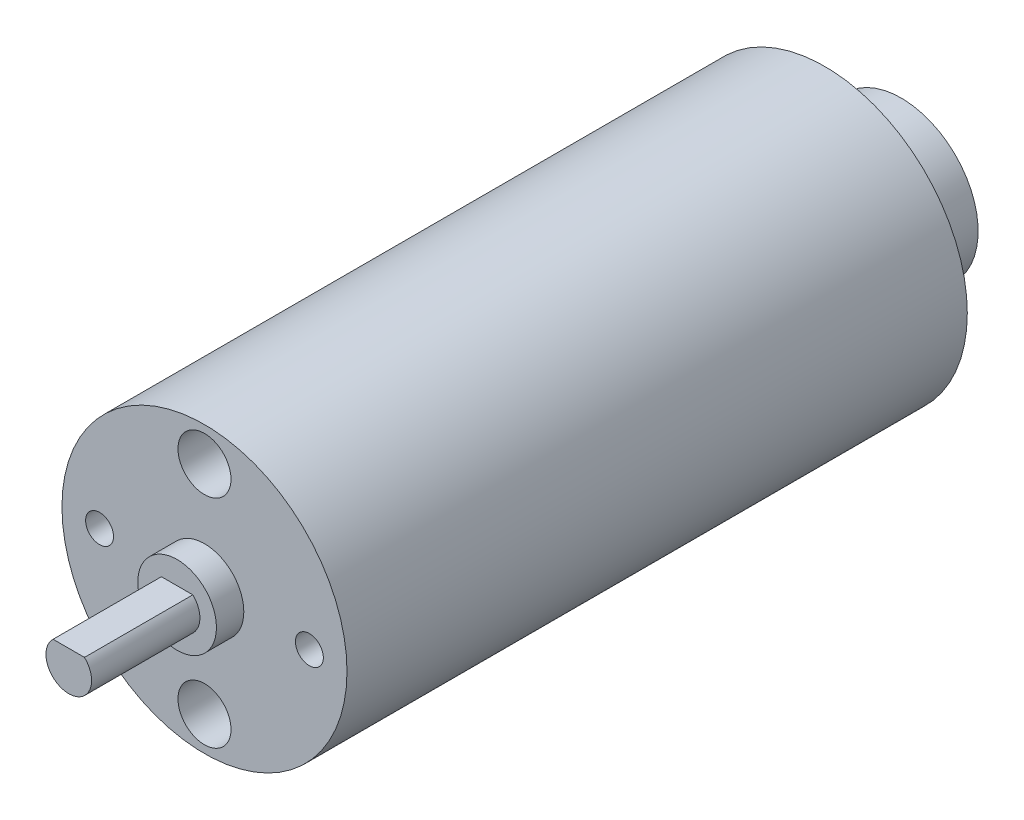
ISO-10303-21;
HEADER;
FILE_DESCRIPTION(('STEP AP214'),'2;1');
FILE_NAME('part.step','',(''),(''),'','','');
FILE_SCHEMA(('AUTOMOTIVE_DESIGN { 1 0 10303 214 1 1 1 1 }'));
ENDSEC;
DATA;
#1=APPLICATION_CONTEXT('core data for automotive mechanical design processes');
#2=APPLICATION_PROTOCOL_DEFINITION('international standard','automotive_design',2000,#1);
#3=PRODUCT_CONTEXT('',#1,'mechanical');
#4=PRODUCT('Part','Part','',(#3));
#5=PRODUCT_RELATED_PRODUCT_CATEGORY('part','',(#4));
#6=PRODUCT_DEFINITION_FORMATION('','',#4);
#7=PRODUCT_DEFINITION_CONTEXT('part definition',#1,'design');
#8=PRODUCT_DEFINITION('design','',#6,#7);
#9=PRODUCT_DEFINITION_SHAPE('','',#8);
#10=(LENGTH_UNIT() NAMED_UNIT(*) SI_UNIT(.MILLI.,.METRE.));
#11=(NAMED_UNIT(*) PLANE_ANGLE_UNIT() SI_UNIT($,.RADIAN.));
#12=(NAMED_UNIT(*) SI_UNIT($,.STERADIAN.) SOLID_ANGLE_UNIT());
#13=UNCERTAINTY_MEASURE_WITH_UNIT(LENGTH_MEASURE(1.E-05),#10,'distance_accuracy_value','');
#14=(GEOMETRIC_REPRESENTATION_CONTEXT(3) GLOBAL_UNCERTAINTY_ASSIGNED_CONTEXT((#13)) GLOBAL_UNIT_ASSIGNED_CONTEXT((#10,
#11,#12)) REPRESENTATION_CONTEXT('',''));
#15=CARTESIAN_POINT('',(0.,0.,0.));
#16=DIRECTION('',(0.,0.,1.));
#17=DIRECTION('',(1.,0.,0.));
#18=AXIS2_PLACEMENT_3D('',#15,#16,#17);
#19=CARTESIAN_POINT('',(0.,0.,54.4));
#20=DIRECTION('',(0.,0.,-1.));
#21=DIRECTION('',(-1.,0.,0.));
#22=AXIS2_PLACEMENT_3D('',#19,#20,#21);
#23=CYLINDRICAL_SURFACE('',#22,12.5);
#24=CARTESIAN_POINT('',(0.,0.,54.4));
#25=DIRECTION('',(0.,0.,1.));
#26=DIRECTION('',(1.,0.,0.));
#27=AXIS2_PLACEMENT_3D('',#24,#25,#26);
#28=CIRCLE('',#27,12.5);
#29=CARTESIAN_POINT('',(12.5,0.,54.4));
#30=VERTEX_POINT('',#29);
#31=EDGE_CURVE('E80',#30,#30,#28,.T.);
#32=ORIENTED_EDGE('',*,*,#31,.F.);
#33=EDGE_LOOP('',(#32));
#34=FACE_BOUND('',#33,.T.);
#35=CARTESIAN_POINT('',(0.,0.,0.));
#36=DIRECTION('',(0.,0.,1.));
#37=DIRECTION('',(1.,0.,0.));
#38=AXIS2_PLACEMENT_3D('',#35,#36,#37);
#39=CIRCLE('',#38,12.5);
#40=CARTESIAN_POINT('',(12.5,0.,0.));
#41=VERTEX_POINT('',#40);
#42=EDGE_CURVE('E72',#41,#41,#39,.T.);
#43=ORIENTED_EDGE('',*,*,#42,.T.);
#44=EDGE_LOOP('',(#43));
#45=FACE_BOUND('',#44,.T.);
#46=ADVANCED_FACE('F32',(#34,#45),#23,.T.);
#47=CARTESIAN_POINT('',(0.,0.,54.4));
#48=DIRECTION('',(0.,0.,1.));
#49=DIRECTION('',(1.,0.,0.));
#50=AXIS2_PLACEMENT_3D('',#47,#48,#49);
#51=PLANE('',#50);
#52=CARTESIAN_POINT('',(9.2,0.,54.4));
#53=DIRECTION('',(0.,0.,1.));
#54=DIRECTION('',(1.,0.,0.));
#55=AXIS2_PLACEMENT_3D('',#52,#53,#54);
#56=CIRCLE('',#55,1.225);
#57=CARTESIAN_POINT('',(10.425,0.,54.4));
#58=VERTEX_POINT('',#57);
#59=EDGE_CURVE('E282',#58,#58,#56,.T.);
#60=ORIENTED_EDGE('',*,*,#59,.F.);
#61=EDGE_LOOP('',(#60));
#62=FACE_BOUND('',#61,.T.);
#63=CARTESIAN_POINT('',(-9.2,0.,54.4));
#64=DIRECTION('',(0.,0.,1.));
#65=DIRECTION('',(1.,0.,0.));
#66=AXIS2_PLACEMENT_3D('',#63,#64,#65);
#67=CIRCLE('',#66,1.225);
#68=CARTESIAN_POINT('',(-7.975,0.,54.4));
#69=VERTEX_POINT('',#68);
#70=EDGE_CURVE('E275',#69,#69,#67,.T.);
#71=ORIENTED_EDGE('',*,*,#70,.F.);
#72=EDGE_LOOP('',(#71));
#73=FACE_BOUND('',#72,.T.);
#74=CARTESIAN_POINT('',(0.,9.5,54.4));
#75=DIRECTION('',(0.,0.,1.));
#76=DIRECTION('',(1.,0.,0.));
#77=AXIS2_PLACEMENT_3D('',#74,#75,#76);
#78=CIRCLE('',#77,2.325);
#79=CARTESIAN_POINT('',(2.325,9.5,54.4));
#80=VERTEX_POINT('',#79);
#81=EDGE_CURVE('E263',#80,#80,#78,.T.);
#82=ORIENTED_EDGE('',*,*,#81,.F.);
#83=EDGE_LOOP('',(#82));
#84=FACE_BOUND('',#83,.T.);
#85=CARTESIAN_POINT('',(0.,-9.5,54.4));
#86=DIRECTION('',(0.,0.,1.));
#87=DIRECTION('',(1.,0.,0.));
#88=AXIS2_PLACEMENT_3D('',#85,#86,#87);
#89=CIRCLE('',#88,2.325);
#90=CARTESIAN_POINT('',(2.32499999999993,-9.5,54.4));
#91=VERTEX_POINT('',#90);
#92=EDGE_CURVE('E266',#91,#91,#89,.T.);
#93=ORIENTED_EDGE('',*,*,#92,.F.);
#94=EDGE_LOOP('',(#93));
#95=FACE_BOUND('',#94,.T.);
#96=CARTESIAN_POINT('',(0.,0.,54.4));
#97=DIRECTION('',(0.,0.,1.));
#98=DIRECTION('',(1.,0.,0.));
#99=AXIS2_PLACEMENT_3D('',#96,#97,#98);
#100=CIRCLE('',#99,3.45);
#101=CARTESIAN_POINT('',(3.45,0.,54.4));
#102=VERTEX_POINT('',#101);
#103=EDGE_CURVE('E76',#102,#102,#100,.T.);
#104=ORIENTED_EDGE('',*,*,#103,.F.);
#105=EDGE_LOOP('',(#104));
#106=FACE_BOUND('',#105,.T.);
#107=ORIENTED_EDGE('',*,*,#31,.T.);
#108=EDGE_LOOP('',(#107));
#109=FACE_BOUND('',#108,.T.);
#110=ADVANCED_FACE('F90',(#62,#73,#84,#95,#106,#109),#51,.T.);
#111=CARTESIAN_POINT('',(0.,0.,0.));
#112=DIRECTION('',(0.,0.,1.));
#113=DIRECTION('',(1.,0.,0.));
#114=AXIS2_PLACEMENT_3D('',#111,#112,#113);
#115=PLANE('',#114);
#116=CARTESIAN_POINT('',(0.,0.,0.));
#117=DIRECTION('',(0.,0.,1.));
#118=DIRECTION('',(1.,0.,0.));
#119=AXIS2_PLACEMENT_3D('',#116,#117,#118);
#120=CIRCLE('',#119,1.);
#121=CARTESIAN_POINT('',(1.,0.,0.));
#122=VERTEX_POINT('',#121);
#123=EDGE_CURVE('E11',#122,#122,#120,.F.);
#124=ORIENTED_EDGE('',*,*,#123,.F.);
#125=EDGE_LOOP('',(#124));
#126=FACE_BOUND('',#125,.T.);
#127=ORIENTED_EDGE('',*,*,#42,.F.);
#128=EDGE_LOOP('',(#127));
#129=FACE_BOUND('',#128,.T.);
#130=ADVANCED_FACE('F87',(#126,#129),#115,.F.);
#131=CARTESIAN_POINT('',(0.,0.,56.8));
#132=DIRECTION('',(0.,0.,-1.));
#133=DIRECTION('',(-1.,0.,0.));
#134=AXIS2_PLACEMENT_3D('',#131,#132,#133);
#135=CYLINDRICAL_SURFACE('',#134,3.45);
#136=CARTESIAN_POINT('',(0.,0.,56.8));
#137=DIRECTION('',(0.,0.,1.));
#138=DIRECTION('',(1.,0.,0.));
#139=AXIS2_PLACEMENT_3D('',#136,#137,#138);
#140=CIRCLE('',#139,3.45);
#141=CARTESIAN_POINT('',(3.45,0.,56.8));
#142=VERTEX_POINT('',#141);
#143=EDGE_CURVE('E69',#142,#142,#140,.T.);
#144=ORIENTED_EDGE('',*,*,#143,.F.);
#145=EDGE_LOOP('',(#144));
#146=FACE_BOUND('',#145,.T.);
#147=ORIENTED_EDGE('',*,*,#103,.T.);
#148=EDGE_LOOP('',(#147));
#149=FACE_BOUND('',#148,.T.);
#150=ADVANCED_FACE('F89',(#146,#149),#135,.T.);
#151=CARTESIAN_POINT('',(0.,0.,56.8));
#152=DIRECTION('',(0.,0.,1.));
#153=DIRECTION('',(1.,0.,0.));
#154=AXIS2_PLACEMENT_3D('',#151,#152,#153);
#155=PLANE('',#154);
#156=CARTESIAN_POINT('',(0.,0.,56.8));
#157=DIRECTION('',(0.,0.,1.));
#158=DIRECTION('',(1.,0.,0.));
#159=AXIS2_PLACEMENT_3D('',#156,#157,#158);
#160=CIRCLE('',#159,2.);
#161=CARTESIAN_POINT('',(-1.37749773139559,1.45,56.8));
#162=VERTEX_POINT('',#161);
#163=CARTESIAN_POINT('',(1.37749773139559,1.45,56.8));
#164=VERTEX_POINT('',#163);
#165=EDGE_CURVE('E60',#162,#164,#160,.T.);
#166=ORIENTED_EDGE('',*,*,#165,.F.);
#167=DIRECTION('',(1.,0.,0.));
#168=VECTOR('',#167,1.);
#169=CARTESIAN_POINT('',(-3.14281085051245,1.45,56.8));
#170=LINE('',#169,#168);
#171=EDGE_CURVE('E66',#162,#164,#170,.T.);
#172=ORIENTED_EDGE('',*,*,#171,.T.);
#173=EDGE_LOOP('',(#166,#172));
#174=FACE_BOUND('',#173,.T.);
#175=ORIENTED_EDGE('',*,*,#143,.T.);
#176=EDGE_LOOP('',(#175));
#177=FACE_BOUND('',#176,.T.);
#178=ADVANCED_FACE('F96',(#174,#177),#155,.T.);
#179=CARTESIAN_POINT('',(0.,0.,66.3));
#180=DIRECTION('',(0.,0.,-1.));
#181=DIRECTION('',(-1.,0.,0.));
#182=AXIS2_PLACEMENT_3D('',#179,#180,#181);
#183=CYLINDRICAL_SURFACE('',#182,2.);
#184=CARTESIAN_POINT('',(0.,0.,66.3));
#185=DIRECTION('',(0.,0.,1.));
#186=DIRECTION('',(1.,0.,0.));
#187=AXIS2_PLACEMENT_3D('',#184,#185,#186);
#188=CIRCLE('',#187,2.);
#189=CARTESIAN_POINT('',(-1.37749773139559,1.45,66.3));
#190=VERTEX_POINT('',#189);
#191=CARTESIAN_POINT('',(1.37749773139559,1.45,66.3));
#192=VERTEX_POINT('',#191);
#193=EDGE_CURVE('E64',#190,#192,#188,.T.);
#194=ORIENTED_EDGE('',*,*,#193,.F.);
#195=DIRECTION('',(0.,0.,-1.));
#196=VECTOR('',#195,1.);
#197=CARTESIAN_POINT('',(-1.37749773139559,1.45,66.3));
#198=LINE('',#197,#196);
#199=EDGE_CURVE('E46',#190,#162,#198,.T.);
#200=ORIENTED_EDGE('',*,*,#199,.T.);
#201=ORIENTED_EDGE('',*,*,#165,.T.);
#202=DIRECTION('',(0.,0.,-1.));
#203=VECTOR('',#202,1.);
#204=CARTESIAN_POINT('',(1.37749773139559,1.45,66.3));
#205=LINE('',#204,#203);
#206=EDGE_CURVE('E51',#164,#192,#205,.F.);
#207=ORIENTED_EDGE('',*,*,#206,.T.);
#208=EDGE_LOOP('',(#194,#200,#201,#207));
#209=FACE_BOUND('',#208,.T.);
#210=ADVANCED_FACE('F63',(#209),#183,.T.);
#211=CARTESIAN_POINT('',(0.,0.,66.3));
#212=DIRECTION('',(0.,0.,1.));
#213=DIRECTION('',(1.,0.,0.));
#214=AXIS2_PLACEMENT_3D('',#211,#212,#213);
#215=PLANE('',#214);
#216=DIRECTION('',(1.,0.,0.));
#217=VECTOR('',#216,1.);
#218=CARTESIAN_POINT('',(0.,1.45,66.3));
#219=LINE('',#218,#217);
#220=EDGE_CURVE('E39',#190,#192,#219,.T.);
#221=ORIENTED_EDGE('',*,*,#220,.F.);
#222=ORIENTED_EDGE('',*,*,#193,.T.);
#223=EDGE_LOOP('',(#221,#222));
#224=FACE_BOUND('',#223,.T.);
#225=ADVANCED_FACE('F68',(#224),#215,.T.);
#226=CARTESIAN_POINT('',(-3.14281085051245,1.45,56.8));
#227=DIRECTION('',(0.,-1.,0.));
#228=DIRECTION('',(0.,0.,-1.));
#229=AXIS2_PLACEMENT_3D('',#226,#227,#228);
#230=PLANE('',#229);
#231=ORIENTED_EDGE('',*,*,#220,.T.);
#232=ORIENTED_EDGE('',*,*,#206,.F.);
#233=ORIENTED_EDGE('',*,*,#171,.F.);
#234=ORIENTED_EDGE('',*,*,#199,.F.);
#235=EDGE_LOOP('',(#231,#232,#233,#234));
#236=FACE_BOUND('',#235,.T.);
#237=ADVANCED_FACE('F56',(#236),#230,.F.);
#238=CARTESIAN_POINT('',(0.,-9.5,49.95));
#239=DIRECTION('',(0.,0.,1.));
#240=DIRECTION('',(1.,0.,0.));
#241=AXIS2_PLACEMENT_3D('',#238,#239,#240);
#242=CYLINDRICAL_SURFACE('',#241,2.325);
#243=CARTESIAN_POINT('',(0.,-9.5,49.95));
#244=DIRECTION('',(0.,0.,1.));
#245=DIRECTION('',(1.,0.,0.));
#246=AXIS2_PLACEMENT_3D('',#243,#244,#245);
#247=CIRCLE('',#246,2.325);
#248=CARTESIAN_POINT('',(2.32499999999993,-9.5,49.95));
#249=VERTEX_POINT('',#248);
#250=EDGE_CURVE('E269',#249,#249,#247,.T.);
#251=ORIENTED_EDGE('',*,*,#250,.F.);
#252=EDGE_LOOP('',(#251));
#253=FACE_BOUND('',#252,.T.);
#254=ORIENTED_EDGE('',*,*,#92,.T.);
#255=EDGE_LOOP('',(#254));
#256=FACE_BOUND('',#255,.T.);
#257=ADVANCED_FACE('F240',(#253,#256),#242,.F.);
#258=CARTESIAN_POINT('',(0.,-9.5,49.95));
#259=DIRECTION('',(0.,0.,1.));
#260=DIRECTION('',(1.,0.,0.));
#261=AXIS2_PLACEMENT_3D('',#258,#259,#260);
#262=PLANE('',#261);
#263=ORIENTED_EDGE('',*,*,#250,.T.);
#264=EDGE_LOOP('',(#263));
#265=FACE_BOUND('',#264,.T.);
#266=ADVANCED_FACE('F236',(#265),#262,.T.);
#267=CARTESIAN_POINT('',(0.,9.5,49.95));
#268=DIRECTION('',(0.,0.,1.));
#269=DIRECTION('',(1.,0.,0.));
#270=AXIS2_PLACEMENT_3D('',#267,#268,#269);
#271=CYLINDRICAL_SURFACE('',#270,2.325);
#272=CARTESIAN_POINT('',(0.,9.5,49.95));
#273=DIRECTION('',(0.,0.,1.));
#274=DIRECTION('',(1.,0.,0.));
#275=AXIS2_PLACEMENT_3D('',#272,#273,#274);
#276=CIRCLE('',#275,2.325);
#277=CARTESIAN_POINT('',(2.325,9.5,49.95));
#278=VERTEX_POINT('',#277);
#279=EDGE_CURVE('E260',#278,#278,#276,.T.);
#280=ORIENTED_EDGE('',*,*,#279,.F.);
#281=EDGE_LOOP('',(#280));
#282=FACE_BOUND('',#281,.T.);
#283=ORIENTED_EDGE('',*,*,#81,.T.);
#284=EDGE_LOOP('',(#283));
#285=FACE_BOUND('',#284,.T.);
#286=ADVANCED_FACE('F232',(#282,#285),#271,.F.);
#287=CARTESIAN_POINT('',(0.,9.5,49.95));
#288=DIRECTION('',(0.,0.,1.));
#289=DIRECTION('',(1.,0.,0.));
#290=AXIS2_PLACEMENT_3D('',#287,#288,#289);
#291=PLANE('',#290);
#292=ORIENTED_EDGE('',*,*,#279,.T.);
#293=EDGE_LOOP('',(#292));
#294=FACE_BOUND('',#293,.T.);
#295=ADVANCED_FACE('F120',(#294),#291,.T.);
#296=CARTESIAN_POINT('',(-9.2,0.,49.95));
#297=DIRECTION('',(0.,0.,1.));
#298=DIRECTION('',(1.,0.,0.));
#299=AXIS2_PLACEMENT_3D('',#296,#297,#298);
#300=CYLINDRICAL_SURFACE('',#299,1.225);
#301=CARTESIAN_POINT('',(-9.2,0.,49.95));
#302=DIRECTION('',(0.,0.,1.));
#303=DIRECTION('',(1.,0.,0.));
#304=AXIS2_PLACEMENT_3D('',#301,#302,#303);
#305=CIRCLE('',#304,1.225);
#306=CARTESIAN_POINT('',(-7.975,0.,49.95));
#307=VERTEX_POINT('',#306);
#308=EDGE_CURVE('E278',#307,#307,#305,.T.);
#309=ORIENTED_EDGE('',*,*,#308,.F.);
#310=EDGE_LOOP('',(#309));
#311=FACE_BOUND('',#310,.T.);
#312=ORIENTED_EDGE('',*,*,#70,.T.);
#313=EDGE_LOOP('',(#312));
#314=FACE_BOUND('',#313,.T.);
#315=ADVANCED_FACE('F125',(#311,#314),#300,.F.);
#316=CARTESIAN_POINT('',(-9.2,0.,49.95));
#317=DIRECTION('',(0.,0.,1.));
#318=DIRECTION('',(1.,0.,0.));
#319=AXIS2_PLACEMENT_3D('',#316,#317,#318);
#320=PLANE('',#319);
#321=ORIENTED_EDGE('',*,*,#308,.T.);
#322=EDGE_LOOP('',(#321));
#323=FACE_BOUND('',#322,.T.);
#324=ADVANCED_FACE('F130',(#323),#320,.T.);
#325=CARTESIAN_POINT('',(9.2,0.,49.95));
#326=DIRECTION('',(0.,0.,1.));
#327=DIRECTION('',(1.,0.,0.));
#328=AXIS2_PLACEMENT_3D('',#325,#326,#327);
#329=CYLINDRICAL_SURFACE('',#328,1.225);
#330=CARTESIAN_POINT('',(9.2,0.,49.95));
#331=DIRECTION('',(0.,0.,1.));
#332=DIRECTION('',(1.,0.,0.));
#333=AXIS2_PLACEMENT_3D('',#330,#331,#332);
#334=CIRCLE('',#333,1.225);
#335=CARTESIAN_POINT('',(10.425,0.,49.95));
#336=VERTEX_POINT('',#335);
#337=EDGE_CURVE('E270',#336,#336,#334,.T.);
#338=ORIENTED_EDGE('',*,*,#337,.F.);
#339=EDGE_LOOP('',(#338));
#340=FACE_BOUND('',#339,.T.);
#341=ORIENTED_EDGE('',*,*,#59,.T.);
#342=EDGE_LOOP('',(#341));
#343=FACE_BOUND('',#342,.T.);
#344=ADVANCED_FACE('F140',(#340,#343),#329,.F.);
#345=CARTESIAN_POINT('',(9.2,0.,49.95));
#346=DIRECTION('',(0.,0.,1.));
#347=DIRECTION('',(1.,0.,0.));
#348=AXIS2_PLACEMENT_3D('',#345,#346,#347);
#349=PLANE('',#348);
#350=ORIENTED_EDGE('',*,*,#337,.T.);
#351=EDGE_LOOP('',(#350));
#352=FACE_BOUND('',#351,.T.);
#353=ADVANCED_FACE('F150',(#352),#349,.T.);
#354=CARTESIAN_POINT('',(0.,0.,-2.2));
#355=DIRECTION('',(0.,0.,1.));
#356=DIRECTION('',(1.,0.,0.));
#357=AXIS2_PLACEMENT_3D('',#354,#355,#356);
#358=CYLINDRICAL_SURFACE('',#357,1.);
#359=CARTESIAN_POINT('',(0.,0.,-2.2));
#360=DIRECTION('',(0.,0.,-1.));
#361=DIRECTION('',(-1.,0.,0.));
#362=AXIS2_PLACEMENT_3D('',#359,#360,#361);
#363=CIRCLE('',#362,1.);
#364=CARTESIAN_POINT('',(-1.,0.,-2.2));
#365=VERTEX_POINT('',#364);
#366=EDGE_CURVE('E279',#365,#365,#363,.T.);
#367=ORIENTED_EDGE('',*,*,#366,.F.);
#368=EDGE_LOOP('',(#367));
#369=FACE_BOUND('',#368,.T.);
#370=ORIENTED_EDGE('',*,*,#123,.T.);
#371=EDGE_LOOP('',(#370));
#372=FACE_BOUND('',#371,.T.);
#373=ADVANCED_FACE('F159',(#369,#372),#358,.T.);
#374=CARTESIAN_POINT('',(0.,0.,-2.2));
#375=DIRECTION('',(0.,0.,-1.));
#376=DIRECTION('',(-1.,0.,0.));
#377=AXIS2_PLACEMENT_3D('',#374,#375,#376);
#378=PLANE('',#377);
#379=ORIENTED_EDGE('',*,*,#366,.T.);
#380=EDGE_LOOP('',(#379));
#381=FACE_BOUND('',#380,.T.);
#382=CARTESIAN_POINT('',(0.,0.,-2.2));
#383=DIRECTION('',(0.,0.,-1.));
#384=DIRECTION('',(-1.,0.,0.));
#385=AXIS2_PLACEMENT_3D('',#382,#383,#384);
#386=CIRCLE('',#385,6.75);
#387=CARTESIAN_POINT('',(-6.75,0.,-2.2));
#388=VERTEX_POINT('',#387);
#389=EDGE_CURVE('E289',#388,#388,#386,.T.);
#390=ORIENTED_EDGE('',*,*,#389,.F.);
#391=EDGE_LOOP('',(#390));
#392=FACE_BOUND('',#391,.T.);
#393=ADVANCED_FACE('F175',(#381,#392),#378,.F.);
#394=CARTESIAN_POINT('',(0.,0.,-7.7));
#395=DIRECTION('',(0.,0.,-1.));
#396=DIRECTION('',(-1.,0.,0.));
#397=AXIS2_PLACEMENT_3D('',#394,#395,#396);
#398=PLANE('',#397);
#399=CARTESIAN_POINT('',(0.,0.,-7.7));
#400=DIRECTION('',(0.,0.,-1.));
#401=DIRECTION('',(-1.,0.,0.));
#402=AXIS2_PLACEMENT_3D('',#399,#400,#401);
#403=CIRCLE('',#402,1.);
#404=CARTESIAN_POINT('',(1.,0.,-7.7));
#405=VERTEX_POINT('',#404);
#406=EDGE_CURVE('E295',#405,#405,#403,.T.);
#407=ORIENTED_EDGE('',*,*,#406,.T.);
#408=EDGE_LOOP('',(#407));
#409=FACE_BOUND('',#408,.T.);
#410=ADVANCED_FACE('F185',(#409),#398,.T.);
#411=CARTESIAN_POINT('',(0.,0.,-7.7));
#412=DIRECTION('',(0.,0.,1.));
#413=DIRECTION('',(1.,0.,0.));
#414=AXIS2_PLACEMENT_3D('',#411,#412,#413);
#415=CYLINDRICAL_SURFACE('',#414,1.);
#416=CARTESIAN_POINT('',(0.,0.,-6.7));
#417=DIRECTION('',(0.,0.,-1.));
#418=DIRECTION('',(-1.,0.,0.));
#419=AXIS2_PLACEMENT_3D('',#416,#417,#418);
#420=CIRCLE('',#419,1.);
#421=CARTESIAN_POINT('',(1.,0.,-6.7));
#422=VERTEX_POINT('',#421);
#423=EDGE_CURVE('E294',#422,#422,#420,.T.);
#424=CARTESIAN_POINT('',(1.,0.,-6.7));
#425=CARTESIAN_POINT('',(1.,0.,-6.71041666666667));
#426=CARTESIAN_POINT('',(1.,0.,-6.72083333333333));
#427=CARTESIAN_POINT('',(1.,0.,-6.74166666666667));
#428=CARTESIAN_POINT('',(1.,0.,-6.75208333333333));
#429=CARTESIAN_POINT('',(1.,0.,-6.77291666666667));
#430=CARTESIAN_POINT('',(1.,0.,-6.78333333333333));
#431=CARTESIAN_POINT('',(1.,0.,-6.80416666666667));
#432=CARTESIAN_POINT('',(1.,0.,-6.81458333333333));
#433=CARTESIAN_POINT('',(1.,0.,-6.83541666666667));
#434=CARTESIAN_POINT('',(1.,0.,-6.84583333333333));
#435=CARTESIAN_POINT('',(1.,0.,-6.86666666666667));
#436=CARTESIAN_POINT('',(1.,0.,-6.87708333333333));
#437=CARTESIAN_POINT('',(1.,0.,-6.89791666666667));
#438=CARTESIAN_POINT('',(1.,0.,-6.90833333333333));
#439=CARTESIAN_POINT('',(1.,0.,-6.92916666666667));
#440=CARTESIAN_POINT('',(1.,0.,-6.93958333333333));
#441=CARTESIAN_POINT('',(1.,0.,-6.96041666666667));
#442=CARTESIAN_POINT('',(1.,0.,-6.97083333333333));
#443=CARTESIAN_POINT('',(1.,0.,-6.99166666666667));
#444=CARTESIAN_POINT('',(1.,0.,-7.00208333333333));
#445=CARTESIAN_POINT('',(1.,0.,-7.02291666666667));
#446=CARTESIAN_POINT('',(1.,0.,-7.03333333333333));
#447=CARTESIAN_POINT('',(1.,0.,-7.05416666666667));
#448=CARTESIAN_POINT('',(1.,0.,-7.06458333333333));
#449=CARTESIAN_POINT('',(1.,0.,-7.08541666666667));
#450=CARTESIAN_POINT('',(1.,0.,-7.09583333333333));
#451=CARTESIAN_POINT('',(1.,0.,-7.11666666666667));
#452=CARTESIAN_POINT('',(1.,0.,-7.12708333333333));
#453=CARTESIAN_POINT('',(1.,0.,-7.14791666666667));
#454=CARTESIAN_POINT('',(1.,0.,-7.15833333333333));
#455=CARTESIAN_POINT('',(1.,0.,-7.17916666666667));
#456=CARTESIAN_POINT('',(1.,0.,-7.18958333333333));
#457=CARTESIAN_POINT('',(1.,0.,-7.21041666666667));
#458=CARTESIAN_POINT('',(1.,0.,-7.22083333333333));
#459=CARTESIAN_POINT('',(1.,0.,-7.24166666666667));
#460=CARTESIAN_POINT('',(1.,0.,-7.25208333333333));
#461=CARTESIAN_POINT('',(1.,0.,-7.27291666666667));
#462=CARTESIAN_POINT('',(1.,0.,-7.28333333333333));
#463=CARTESIAN_POINT('',(1.,0.,-7.30416666666667));
#464=CARTESIAN_POINT('',(1.,0.,-7.31458333333333));
#465=CARTESIAN_POINT('',(1.,0.,-7.33541666666667));
#466=CARTESIAN_POINT('',(1.,0.,-7.34583333333333));
#467=CARTESIAN_POINT('',(1.,0.,-7.36666666666667));
#468=CARTESIAN_POINT('',(1.,0.,-7.37708333333333));
#469=CARTESIAN_POINT('',(1.,0.,-7.39791666666667));
#470=CARTESIAN_POINT('',(1.,0.,-7.40833333333333));
#471=CARTESIAN_POINT('',(1.,0.,-7.42916666666667));
#472=CARTESIAN_POINT('',(1.,0.,-7.43958333333333));
#473=CARTESIAN_POINT('',(1.,0.,-7.46041666666667));
#474=CARTESIAN_POINT('',(1.,0.,-7.47083333333333));
#475=CARTESIAN_POINT('',(1.,0.,-7.49166666666667));
#476=CARTESIAN_POINT('',(1.,0.,-7.50208333333333));
#477=CARTESIAN_POINT('',(1.,0.,-7.52291666666667));
#478=CARTESIAN_POINT('',(1.,0.,-7.53333333333333));
#479=CARTESIAN_POINT('',(1.,0.,-7.55416666666667));
#480=CARTESIAN_POINT('',(1.,0.,-7.56458333333333));
#481=CARTESIAN_POINT('',(1.,0.,-7.58541666666667));
#482=CARTESIAN_POINT('',(1.,0.,-7.59583333333333));
#483=CARTESIAN_POINT('',(1.,0.,-7.61666666666667));
#484=CARTESIAN_POINT('',(1.,0.,-7.62708333333333));
#485=CARTESIAN_POINT('',(1.,0.,-7.64791666666667));
#486=CARTESIAN_POINT('',(1.,0.,-7.65833333333333));
#487=CARTESIAN_POINT('',(1.,0.,-7.67916666666667));
#488=CARTESIAN_POINT('',(1.,0.,-7.68958333333333));
#489=CARTESIAN_POINT('',(1.,0.,-7.7));
#490=B_SPLINE_CURVE_WITH_KNOTS('',3,(#424,#425,#426,#427,#428,#429,#430,#431,#432,#433,#434,
#435,#436,#437,#438,#439,#440,#441,#442,#443,#444,#445,#446,#447,#448,#449,#450,#451,#452,#453,
#454,#455,#456,#457,#458,#459,#460,#461,#462,#463,#464,#465,#466,#467,#468,#469,#470,#471,#472,
#473,#474,#475,#476,#477,#478,#479,#480,#481,#482,#483,#484,#485,#486,#487,#488,#489),
.UNSPECIFIED.,.F.,.F.,(4,2,2,2,2,2,2,2,2,2,2,2,2,2,2,2,2,2,2,2,2,2,2,2,2,2,2,2,2,2,2,2,4),(0.,
0.03125,0.0625000000000001,0.0937499999999992,0.124999999999999,0.156249999999999,
0.187499999999999,0.218749999999999,0.249999999999999,0.281249999999999,0.312499999999999,
0.343749999999999,0.374999999999999,0.40625,0.4375,0.46875,0.5,0.53125,0.5625,0.59375,0.625,
0.65625,0.6875,0.71875,0.75,0.78125,0.8125,0.84375,0.875,0.90625,0.9375,0.96875,1.),.UNSPECIFIED.);
#491=EDGE_CURVE('BSEAM195',#422,#405,#490,.T.);
#492=ORIENTED_EDGE('',*,*,#423,.T.);
#493=ORIENTED_EDGE('',*,*,#406,.F.);
#494=ORIENTED_EDGE('',*,*,#491,.T.);
#495=ORIENTED_EDGE('',*,*,#491,.F.);
#496=EDGE_LOOP('',(#492,#494,#493,#495));
#497=FACE_BOUND('',#496,.T.);
#498=ADVANCED_FACE('F195',(#497),#415,.T.);
#499=CARTESIAN_POINT('',(0.,0.,-6.7));
#500=DIRECTION('',(0.,0.,-1.));
#501=DIRECTION('',(-1.,0.,0.));
#502=AXIS2_PLACEMENT_3D('',#499,#500,#501);
#503=PLANE('',#502);
#504=ORIENTED_EDGE('',*,*,#423,.F.);
#505=EDGE_LOOP('',(#504));
#506=FACE_BOUND('',#505,.T.);
#507=CARTESIAN_POINT('',(0.,0.,-6.7));
#508=DIRECTION('',(0.,0.,-1.));
#509=DIRECTION('',(-1.,0.,0.));
#510=AXIS2_PLACEMENT_3D('',#507,#508,#509);
#511=CIRCLE('',#510,6.75);
#512=CARTESIAN_POINT('',(-6.75,0.,-6.7));
#513=VERTEX_POINT('',#512);
#514=EDGE_CURVE('E291',#513,#513,#511,.T.);
#515=ORIENTED_EDGE('',*,*,#514,.T.);
#516=EDGE_LOOP('',(#515));
#517=FACE_BOUND('',#516,.T.);
#518=ADVANCED_FACE('F205',(#506,#517),#503,.T.);
#519=CARTESIAN_POINT('',(0.,0.,-6.7));
#520=DIRECTION('',(0.,0.,1.));
#521=DIRECTION('',(1.,0.,0.));
#522=AXIS2_PLACEMENT_3D('',#519,#520,#521);
#523=CYLINDRICAL_SURFACE('',#522,6.75);
#524=ORIENTED_EDGE('',*,*,#389,.T.);
#525=EDGE_LOOP('',(#524));
#526=FACE_BOUND('',#525,.T.);
#527=ORIENTED_EDGE('',*,*,#514,.F.);
#528=EDGE_LOOP('',(#527));
#529=FACE_BOUND('',#528,.T.);
#530=ADVANCED_FACE('F215',(#526,#529),#523,.T.);
#531=CLOSED_SHELL('',(#46,#110,#130,#150,#178,#210,#225,#237,#257,#266,#286,#295,#315,#324,#344,
#353,#373,#393,#410,#498,#518,#530));
#532=MANIFOLD_SOLID_BREP('B2',#531);
#533=ADVANCED_BREP_SHAPE_REPRESENTATION('',(#18,#532),#14);
#534=SHAPE_DEFINITION_REPRESENTATION(#9,#533);
ENDSEC;
END-ISO-10303-21;
